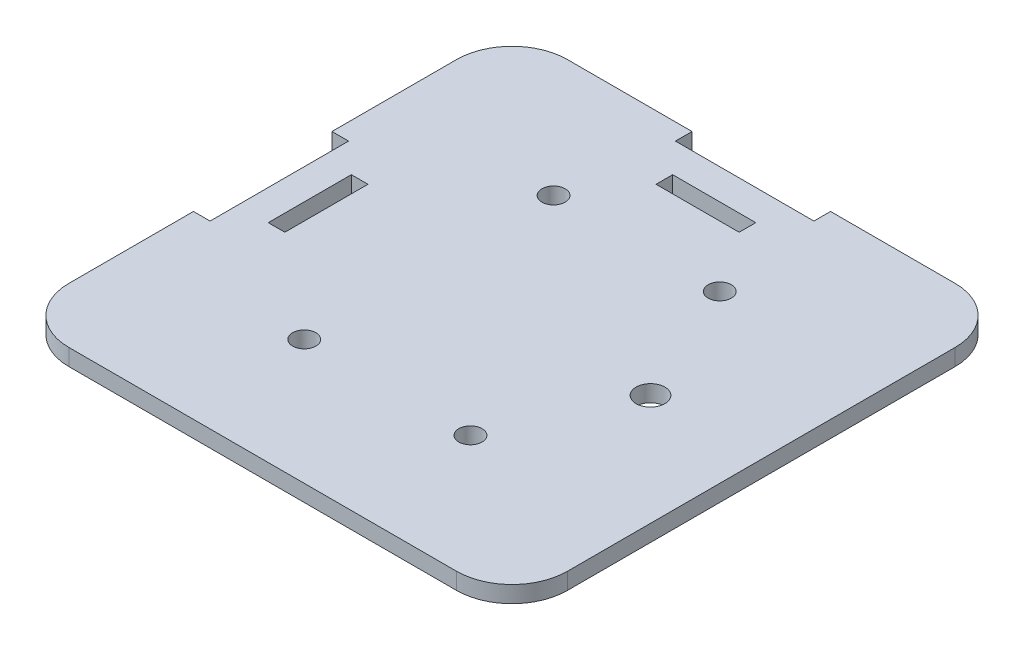
ISO-10303-21;
HEADER;
FILE_DESCRIPTION(('STEP AP214'),'2;1');
FILE_NAME('part.step','',(''),(''),'','','');
FILE_SCHEMA(('AUTOMOTIVE_DESIGN { 1 0 10303 214 1 1 1 1 }'));
ENDSEC;
DATA;
#1=APPLICATION_CONTEXT('core data for automotive mechanical design processes');
#2=APPLICATION_PROTOCOL_DEFINITION('international standard','automotive_design',2000,#1);
#3=PRODUCT_CONTEXT('',#1,'mechanical');
#4=PRODUCT('Part','Part','',(#3));
#5=PRODUCT_RELATED_PRODUCT_CATEGORY('part','',(#4));
#6=PRODUCT_DEFINITION_FORMATION('','',#4);
#7=PRODUCT_DEFINITION_CONTEXT('part definition',#1,'design');
#8=PRODUCT_DEFINITION('design','',#6,#7);
#9=PRODUCT_DEFINITION_SHAPE('','',#8);
#10=(LENGTH_UNIT() NAMED_UNIT(*) SI_UNIT(.MILLI.,.METRE.));
#11=(NAMED_UNIT(*) PLANE_ANGLE_UNIT() SI_UNIT($,.RADIAN.));
#12=(NAMED_UNIT(*) SI_UNIT($,.STERADIAN.) SOLID_ANGLE_UNIT());
#13=UNCERTAINTY_MEASURE_WITH_UNIT(LENGTH_MEASURE(1.E-05),#10,'distance_accuracy_value','');
#14=(GEOMETRIC_REPRESENTATION_CONTEXT(3) GLOBAL_UNCERTAINTY_ASSIGNED_CONTEXT((#13)) GLOBAL_UNIT_ASSIGNED_CONTEXT((#10,
#11,#12)) REPRESENTATION_CONTEXT('',''));
#15=CARTESIAN_POINT('',(0.,0.,0.));
#16=DIRECTION('',(0.,0.,1.));
#17=DIRECTION('',(1.,0.,0.));
#18=AXIS2_PLACEMENT_3D('',#15,#16,#17);
#19=CARTESIAN_POINT('',(-35.,3.,-35.));
#20=DIRECTION('',(0.,-1.,0.));
#21=DIRECTION('',(0.,0.,-1.));
#22=AXIS2_PLACEMENT_3D('',#19,#20,#21);
#23=CYLINDRICAL_SURFACE('',#22,10.);
#24=CARTESIAN_POINT('',(-35.,0.,-35.));
#25=DIRECTION('',(0.,1.,0.));
#26=DIRECTION('',(0.,0.,1.));
#27=AXIS2_PLACEMENT_3D('',#24,#25,#26);
#28=CIRCLE('',#27,10.);
#29=CARTESIAN_POINT('',(-45.,0.,-35.));
#30=VERTEX_POINT('',#29);
#31=CARTESIAN_POINT('',(-35.,0.,-45.));
#32=VERTEX_POINT('',#31);
#33=EDGE_CURVE('E269',#30,#32,#28,.F.);
#34=ORIENTED_EDGE('',*,*,#33,.F.);
#35=DIRECTION('',(0.,-1.,0.));
#36=VECTOR('',#35,1.);
#37=CARTESIAN_POINT('',(-45.,3.,-35.));
#38=LINE('',#37,#36);
#39=CARTESIAN_POINT('',(-45.,3.,-35.));
#40=VERTEX_POINT('',#39);
#41=EDGE_CURVE('E381',#40,#30,#38,.T.);
#42=ORIENTED_EDGE('',*,*,#41,.F.);
#43=CARTESIAN_POINT('',(-35.,3.,-35.));
#44=DIRECTION('',(0.,1.,0.));
#45=DIRECTION('',(0.,0.,1.));
#46=AXIS2_PLACEMENT_3D('',#43,#44,#45);
#47=CIRCLE('',#46,10.);
#48=CARTESIAN_POINT('',(-35.,3.,-45.));
#49=VERTEX_POINT('',#48);
#50=EDGE_CURVE('E272',#40,#49,#47,.F.);
#51=ORIENTED_EDGE('',*,*,#50,.T.);
#52=DIRECTION('',(0.,-1.,0.));
#53=VECTOR('',#52,1.);
#54=CARTESIAN_POINT('',(-35.,3.,-45.));
#55=LINE('',#54,#53);
#56=EDGE_CURVE('E346',#49,#32,#55,.T.);
#57=ORIENTED_EDGE('',*,*,#56,.T.);
#58=EDGE_LOOP('',(#34,#42,#51,#57));
#59=FACE_BOUND('',#58,.T.);
#60=ADVANCED_FACE('F35',(#59),#23,.T.);
#61=CARTESIAN_POINT('',(-45.,3.,0.));
#62=DIRECTION('',(-1.,0.,0.));
#63=DIRECTION('',(0.,0.,1.));
#64=AXIS2_PLACEMENT_3D('',#61,#62,#63);
#65=PLANE('',#64);
#66=DIRECTION('',(0.,0.,-1.));
#67=VECTOR('',#66,1.);
#68=CARTESIAN_POINT('',(-45.,0.,0.));
#69=LINE('',#68,#67);
#70=CARTESIAN_POINT('',(-45.,0.,-12.5));
#71=VERTEX_POINT('',#70);
#72=EDGE_CURVE('E311',#71,#30,#69,.T.);
#73=ORIENTED_EDGE('',*,*,#72,.F.);
#74=DIRECTION('',(0.,-1.,0.));
#75=VECTOR('',#74,1.);
#76=CARTESIAN_POINT('',(-45.,3.,-12.5));
#77=LINE('',#76,#75);
#78=CARTESIAN_POINT('',(-45.,3.,-12.5));
#79=VERTEX_POINT('',#78);
#80=EDGE_CURVE('E379',#79,#71,#77,.T.);
#81=ORIENTED_EDGE('',*,*,#80,.F.);
#82=DIRECTION('',(0.,0.,-1.));
#83=VECTOR('',#82,1.);
#84=CARTESIAN_POINT('',(-45.,3.,0.));
#85=LINE('',#84,#83);
#86=EDGE_CURVE('E275',#79,#40,#85,.T.);
#87=ORIENTED_EDGE('',*,*,#86,.T.);
#88=ORIENTED_EDGE('',*,*,#41,.T.);
#89=EDGE_LOOP('',(#73,#81,#87,#88));
#90=FACE_BOUND('',#89,.T.);
#91=ADVANCED_FACE('F420',(#90),#65,.T.);
#92=CARTESIAN_POINT('',(0.,3.,-12.5));
#93=DIRECTION('',(0.,0.,-1.));
#94=DIRECTION('',(-1.,0.,0.));
#95=AXIS2_PLACEMENT_3D('',#92,#93,#94);
#96=PLANE('',#95);
#97=DIRECTION('',(1.,0.,0.));
#98=VECTOR('',#97,1.);
#99=CARTESIAN_POINT('',(0.,0.,-12.5));
#100=LINE('',#99,#98);
#101=CARTESIAN_POINT('',(-42.,0.,-12.5));
#102=VERTEX_POINT('',#101);
#103=EDGE_CURVE('E314',#71,#102,#100,.T.);
#104=ORIENTED_EDGE('',*,*,#103,.T.);
#105=DIRECTION('',(0.,-1.,0.));
#106=VECTOR('',#105,1.);
#107=CARTESIAN_POINT('',(-42.,3.,-12.5));
#108=LINE('',#107,#106);
#109=CARTESIAN_POINT('',(-42.,3.,-12.5));
#110=VERTEX_POINT('',#109);
#111=EDGE_CURVE('E376',#110,#102,#108,.T.);
#112=ORIENTED_EDGE('',*,*,#111,.F.);
#113=DIRECTION('',(1.,0.,0.));
#114=VECTOR('',#113,1.);
#115=CARTESIAN_POINT('',(0.,3.,-12.5));
#116=LINE('',#115,#114);
#117=EDGE_CURVE('E279',#79,#110,#116,.T.);
#118=ORIENTED_EDGE('',*,*,#117,.F.);
#119=ORIENTED_EDGE('',*,*,#80,.T.);
#120=EDGE_LOOP('',(#104,#112,#118,#119));
#121=FACE_BOUND('',#120,.T.);
#122=ADVANCED_FACE('F425',(#121),#96,.F.);
#123=CARTESIAN_POINT('',(-42.,3.,0.));
#124=DIRECTION('',(1.,0.,0.));
#125=DIRECTION('',(0.,0.,-1.));
#126=AXIS2_PLACEMENT_3D('',#123,#124,#125);
#127=PLANE('',#126);
#128=DIRECTION('',(0.,0.,1.));
#129=VECTOR('',#128,1.);
#130=CARTESIAN_POINT('',(-42.,0.,0.));
#131=LINE('',#130,#129);
#132=CARTESIAN_POINT('',(-42.,0.,12.5));
#133=VERTEX_POINT('',#132);
#134=EDGE_CURVE('E317',#102,#133,#131,.T.);
#135=ORIENTED_EDGE('',*,*,#134,.T.);
#136=DIRECTION('',(0.,-1.,0.));
#137=VECTOR('',#136,1.);
#138=CARTESIAN_POINT('',(-42.,3.,12.5));
#139=LINE('',#138,#137);
#140=CARTESIAN_POINT('',(-42.,3.,12.5));
#141=VERTEX_POINT('',#140);
#142=EDGE_CURVE('E374',#141,#133,#139,.T.);
#143=ORIENTED_EDGE('',*,*,#142,.F.);
#144=DIRECTION('',(0.,0.,1.));
#145=VECTOR('',#144,1.);
#146=CARTESIAN_POINT('',(-42.,3.,0.));
#147=LINE('',#146,#145);
#148=EDGE_CURVE('E282',#110,#141,#147,.T.);
#149=ORIENTED_EDGE('',*,*,#148,.F.);
#150=ORIENTED_EDGE('',*,*,#111,.T.);
#151=EDGE_LOOP('',(#135,#143,#149,#150));
#152=FACE_BOUND('',#151,.T.);
#153=ADVANCED_FACE('F497',(#152),#127,.F.);
#154=CARTESIAN_POINT('',(0.,3.,12.5));
#155=DIRECTION('',(0.,0.,-1.));
#156=DIRECTION('',(-1.,0.,0.));
#157=AXIS2_PLACEMENT_3D('',#154,#155,#156);
#158=PLANE('',#157);
#159=DIRECTION('',(1.,0.,0.));
#160=VECTOR('',#159,1.);
#161=CARTESIAN_POINT('',(0.,0.,12.5));
#162=LINE('',#161,#160);
#163=CARTESIAN_POINT('',(-45.,0.,12.5));
#164=VERTEX_POINT('',#163);
#165=EDGE_CURVE('E320',#164,#133,#162,.T.);
#166=ORIENTED_EDGE('',*,*,#165,.F.);
#167=DIRECTION('',(0.,-1.,0.));
#168=VECTOR('',#167,1.);
#169=CARTESIAN_POINT('',(-45.,3.,12.5));
#170=LINE('',#169,#168);
#171=CARTESIAN_POINT('',(-45.,3.,12.5));
#172=VERTEX_POINT('',#171);
#173=EDGE_CURVE('E372',#172,#164,#170,.T.);
#174=ORIENTED_EDGE('',*,*,#173,.F.);
#175=DIRECTION('',(1.,0.,0.));
#176=VECTOR('',#175,1.);
#177=CARTESIAN_POINT('',(0.,3.,12.5));
#178=LINE('',#177,#176);
#179=EDGE_CURVE('E284',#172,#141,#178,.T.);
#180=ORIENTED_EDGE('',*,*,#179,.T.);
#181=ORIENTED_EDGE('',*,*,#142,.T.);
#182=EDGE_LOOP('',(#166,#174,#180,#181));
#183=FACE_BOUND('',#182,.T.);
#184=ADVANCED_FACE('F494',(#183),#158,.T.);
#185=CARTESIAN_POINT('',(-45.,0.,35.));
#186=VERTEX_POINT('',#185);
#187=EDGE_CURVE('E315',#186,#164,#69,.T.);
#188=ORIENTED_EDGE('',*,*,#187,.F.);
#189=DIRECTION('',(0.,-1.,0.));
#190=VECTOR('',#189,1.);
#191=CARTESIAN_POINT('',(-45.,3.,35.));
#192=LINE('',#191,#190);
#193=CARTESIAN_POINT('',(-45.,3.,35.));
#194=VERTEX_POINT('',#193);
#195=EDGE_CURVE('E370',#194,#186,#192,.T.);
#196=ORIENTED_EDGE('',*,*,#195,.F.);
#197=EDGE_CURVE('E280',#194,#172,#85,.T.);
#198=ORIENTED_EDGE('',*,*,#197,.T.);
#199=ORIENTED_EDGE('',*,*,#173,.T.);
#200=EDGE_LOOP('',(#188,#196,#198,#199));
#201=FACE_BOUND('',#200,.T.);
#202=ADVANCED_FACE('F428',(#201),#65,.T.);
#203=CARTESIAN_POINT('',(-35.,3.,35.));
#204=DIRECTION('',(0.,-1.,0.));
#205=DIRECTION('',(0.,0.,-1.));
#206=AXIS2_PLACEMENT_3D('',#203,#204,#205);
#207=CYLINDRICAL_SURFACE('',#206,10.);
#208=CARTESIAN_POINT('',(-35.,0.,35.));
#209=DIRECTION('',(0.,1.,0.));
#210=DIRECTION('',(0.,0.,1.));
#211=AXIS2_PLACEMENT_3D('',#208,#209,#210);
#212=CIRCLE('',#211,10.);
#213=CARTESIAN_POINT('',(-35.,0.,45.));
#214=VERTEX_POINT('',#213);
#215=EDGE_CURVE('E323',#186,#214,#212,.T.);
#216=ORIENTED_EDGE('',*,*,#215,.T.);
#217=DIRECTION('',(0.,-1.,0.));
#218=VECTOR('',#217,1.);
#219=CARTESIAN_POINT('',(-35.,3.,45.));
#220=LINE('',#219,#218);
#221=CARTESIAN_POINT('',(-35.,3.,45.));
#222=VERTEX_POINT('',#221);
#223=EDGE_CURVE('E368',#222,#214,#220,.T.);
#224=ORIENTED_EDGE('',*,*,#223,.F.);
#225=CARTESIAN_POINT('',(-35.,3.,35.));
#226=DIRECTION('',(0.,1.,0.));
#227=DIRECTION('',(0.,0.,1.));
#228=AXIS2_PLACEMENT_3D('',#225,#226,#227);
#229=CIRCLE('',#228,10.);
#230=EDGE_CURVE('E287',#194,#222,#229,.T.);
#231=ORIENTED_EDGE('',*,*,#230,.F.);
#232=ORIENTED_EDGE('',*,*,#195,.T.);
#233=EDGE_LOOP('',(#216,#224,#231,#232));
#234=FACE_BOUND('',#233,.T.);
#235=ADVANCED_FACE('F509',(#234),#207,.T.);
#236=CARTESIAN_POINT('',(0.,3.,45.));
#237=DIRECTION('',(0.,0.,1.));
#238=DIRECTION('',(1.,0.,0.));
#239=AXIS2_PLACEMENT_3D('',#236,#237,#238);
#240=PLANE('',#239);
#241=DIRECTION('',(-1.,0.,0.));
#242=VECTOR('',#241,1.);
#243=CARTESIAN_POINT('',(0.,0.,45.));
#244=LINE('',#243,#242);
#245=CARTESIAN_POINT('',(35.,0.,45.));
#246=VERTEX_POINT('',#245);
#247=EDGE_CURVE('E326',#246,#214,#244,.T.);
#248=ORIENTED_EDGE('',*,*,#247,.F.);
#249=DIRECTION('',(0.,-1.,0.));
#250=VECTOR('',#249,1.);
#251=CARTESIAN_POINT('',(35.,3.,45.));
#252=LINE('',#251,#250);
#253=CARTESIAN_POINT('',(35.,3.,45.));
#254=VERTEX_POINT('',#253);
#255=EDGE_CURVE('E366',#254,#246,#252,.T.);
#256=ORIENTED_EDGE('',*,*,#255,.F.);
#257=DIRECTION('',(-1.,0.,0.));
#258=VECTOR('',#257,1.);
#259=CARTESIAN_POINT('',(0.,3.,45.));
#260=LINE('',#259,#258);
#261=EDGE_CURVE('E289',#254,#222,#260,.T.);
#262=ORIENTED_EDGE('',*,*,#261,.T.);
#263=ORIENTED_EDGE('',*,*,#223,.T.);
#264=EDGE_LOOP('',(#248,#256,#262,#263));
#265=FACE_BOUND('',#264,.T.);
#266=ADVANCED_FACE('F481',(#265),#240,.T.);
#267=CARTESIAN_POINT('',(35.,3.,35.));
#268=DIRECTION('',(0.,-1.,0.));
#269=DIRECTION('',(0.,0.,-1.));
#270=AXIS2_PLACEMENT_3D('',#267,#268,#269);
#271=CYLINDRICAL_SURFACE('',#270,10.);
#272=CARTESIAN_POINT('',(35.,0.,35.));
#273=DIRECTION('',(0.,1.,0.));
#274=DIRECTION('',(0.,0.,1.));
#275=AXIS2_PLACEMENT_3D('',#272,#273,#274);
#276=CIRCLE('',#275,10.);
#277=CARTESIAN_POINT('',(45.,0.,35.));
#278=VERTEX_POINT('',#277);
#279=EDGE_CURVE('E329',#246,#278,#276,.T.);
#280=ORIENTED_EDGE('',*,*,#279,.T.);
#281=DIRECTION('',(0.,-1.,0.));
#282=VECTOR('',#281,1.);
#283=CARTESIAN_POINT('',(45.,3.,35.));
#284=LINE('',#283,#282);
#285=CARTESIAN_POINT('',(45.,3.,35.));
#286=VERTEX_POINT('',#285);
#287=EDGE_CURVE('E363',#286,#278,#284,.T.);
#288=ORIENTED_EDGE('',*,*,#287,.F.);
#289=CARTESIAN_POINT('',(35.,3.,35.));
#290=DIRECTION('',(0.,1.,0.));
#291=DIRECTION('',(0.,0.,1.));
#292=AXIS2_PLACEMENT_3D('',#289,#290,#291);
#293=CIRCLE('',#292,10.);
#294=EDGE_CURVE('E292',#254,#286,#293,.T.);
#295=ORIENTED_EDGE('',*,*,#294,.F.);
#296=ORIENTED_EDGE('',*,*,#255,.T.);
#297=EDGE_LOOP('',(#280,#288,#295,#296));
#298=FACE_BOUND('',#297,.T.);
#299=ADVANCED_FACE('F478',(#298),#271,.T.);
#300=CARTESIAN_POINT('',(45.,3.,0.));
#301=DIRECTION('',(-1.,0.,0.));
#302=DIRECTION('',(0.,0.,1.));
#303=AXIS2_PLACEMENT_3D('',#300,#301,#302);
#304=PLANE('',#303);
#305=DIRECTION('',(0.,0.,-1.));
#306=VECTOR('',#305,1.);
#307=CARTESIAN_POINT('',(45.,0.,0.));
#308=LINE('',#307,#306);
#309=CARTESIAN_POINT('',(45.,0.,-35.));
#310=VERTEX_POINT('',#309);
#311=EDGE_CURVE('E331',#278,#310,#308,.T.);
#312=ORIENTED_EDGE('',*,*,#311,.T.);
#313=DIRECTION('',(0.,-1.,0.));
#314=VECTOR('',#313,1.);
#315=CARTESIAN_POINT('',(45.,3.,-35.));
#316=LINE('',#315,#314);
#317=CARTESIAN_POINT('',(45.,3.,-35.));
#318=VERTEX_POINT('',#317);
#319=EDGE_CURVE('E360',#318,#310,#316,.T.);
#320=ORIENTED_EDGE('',*,*,#319,.F.);
#321=DIRECTION('',(0.,0.,-1.));
#322=VECTOR('',#321,1.);
#323=CARTESIAN_POINT('',(45.,3.,0.));
#324=LINE('',#323,#322);
#325=EDGE_CURVE('E294',#286,#318,#324,.T.);
#326=ORIENTED_EDGE('',*,*,#325,.F.);
#327=ORIENTED_EDGE('',*,*,#287,.T.);
#328=EDGE_LOOP('',(#312,#320,#326,#327));
#329=FACE_BOUND('',#328,.T.);
#330=ADVANCED_FACE('F473',(#329),#304,.F.);
#331=CARTESIAN_POINT('',(35.,3.,-35.));
#332=DIRECTION('',(0.,-1.,0.));
#333=DIRECTION('',(0.,0.,-1.));
#334=AXIS2_PLACEMENT_3D('',#331,#332,#333);
#335=CYLINDRICAL_SURFACE('',#334,10.);
#336=CARTESIAN_POINT('',(35.,0.,-35.));
#337=DIRECTION('',(0.,1.,0.));
#338=DIRECTION('',(0.,0.,1.));
#339=AXIS2_PLACEMENT_3D('',#336,#337,#338);
#340=CIRCLE('',#339,10.);
#341=CARTESIAN_POINT('',(35.,0.,-45.));
#342=VERTEX_POINT('',#341);
#343=EDGE_CURVE('E333',#310,#342,#340,.T.);
#344=ORIENTED_EDGE('',*,*,#343,.T.);
#345=DIRECTION('',(0.,-1.,0.));
#346=VECTOR('',#345,1.);
#347=CARTESIAN_POINT('',(35.,3.,-45.));
#348=LINE('',#347,#346);
#349=CARTESIAN_POINT('',(35.,3.,-45.));
#350=VERTEX_POINT('',#349);
#351=EDGE_CURVE('E357',#350,#342,#348,.T.);
#352=ORIENTED_EDGE('',*,*,#351,.F.);
#353=CARTESIAN_POINT('',(35.,3.,-35.));
#354=DIRECTION('',(0.,1.,0.));
#355=DIRECTION('',(0.,0.,1.));
#356=AXIS2_PLACEMENT_3D('',#353,#354,#355);
#357=CIRCLE('',#356,10.);
#358=EDGE_CURVE('E296',#318,#350,#357,.T.);
#359=ORIENTED_EDGE('',*,*,#358,.F.);
#360=ORIENTED_EDGE('',*,*,#319,.T.);
#361=EDGE_LOOP('',(#344,#352,#359,#360));
#362=FACE_BOUND('',#361,.T.);
#363=ADVANCED_FACE('F467',(#362),#335,.T.);
#364=CARTESIAN_POINT('',(0.,3.,-45.));
#365=DIRECTION('',(0.,0.,1.));
#366=DIRECTION('',(1.,0.,0.));
#367=AXIS2_PLACEMENT_3D('',#364,#365,#366);
#368=PLANE('',#367);
#369=DIRECTION('',(-1.,0.,0.));
#370=VECTOR('',#369,1.);
#371=CARTESIAN_POINT('',(0.,0.,-45.));
#372=LINE('',#371,#370);
#373=CARTESIAN_POINT('',(12.5,0.,-45.));
#374=VERTEX_POINT('',#373);
#375=EDGE_CURVE('E335',#342,#374,#372,.T.);
#376=ORIENTED_EDGE('',*,*,#375,.T.);
#377=DIRECTION('',(0.,-1.,0.));
#378=VECTOR('',#377,1.);
#379=CARTESIAN_POINT('',(12.5,3.,-45.));
#380=LINE('',#379,#378);
#381=CARTESIAN_POINT('',(12.5,3.,-45.));
#382=VERTEX_POINT('',#381);
#383=EDGE_CURVE('E354',#382,#374,#380,.T.);
#384=ORIENTED_EDGE('',*,*,#383,.F.);
#385=DIRECTION('',(-1.,0.,0.));
#386=VECTOR('',#385,1.);
#387=CARTESIAN_POINT('',(0.,3.,-45.));
#388=LINE('',#387,#386);
#389=EDGE_CURVE('E298',#350,#382,#388,.T.);
#390=ORIENTED_EDGE('',*,*,#389,.F.);
#391=ORIENTED_EDGE('',*,*,#351,.T.);
#392=EDGE_LOOP('',(#376,#384,#390,#391));
#393=FACE_BOUND('',#392,.T.);
#394=ADVANCED_FACE('F463',(#393),#368,.F.);
#395=CARTESIAN_POINT('',(12.5,3.,0.));
#396=DIRECTION('',(1.,0.,0.));
#397=DIRECTION('',(0.,0.,-1.));
#398=AXIS2_PLACEMENT_3D('',#395,#396,#397);
#399=PLANE('',#398);
#400=DIRECTION('',(0.,0.,1.));
#401=VECTOR('',#400,1.);
#402=CARTESIAN_POINT('',(12.5,0.,0.));
#403=LINE('',#402,#401);
#404=CARTESIAN_POINT('',(12.5,0.,-42.));
#405=VERTEX_POINT('',#404);
#406=EDGE_CURVE('E337',#374,#405,#403,.T.);
#407=ORIENTED_EDGE('',*,*,#406,.T.);
#408=DIRECTION('',(0.,-1.,0.));
#409=VECTOR('',#408,1.);
#410=CARTESIAN_POINT('',(12.5,3.,-42.));
#411=LINE('',#410,#409);
#412=CARTESIAN_POINT('',(12.5,3.,-42.));
#413=VERTEX_POINT('',#412);
#414=EDGE_CURVE('E352',#413,#405,#411,.T.);
#415=ORIENTED_EDGE('',*,*,#414,.F.);
#416=DIRECTION('',(0.,0.,1.));
#417=VECTOR('',#416,1.);
#418=CARTESIAN_POINT('',(12.5,3.,0.));
#419=LINE('',#418,#417);
#420=EDGE_CURVE('E300',#382,#413,#419,.T.);
#421=ORIENTED_EDGE('',*,*,#420,.F.);
#422=ORIENTED_EDGE('',*,*,#383,.T.);
#423=EDGE_LOOP('',(#407,#415,#421,#422));
#424=FACE_BOUND('',#423,.T.);
#425=ADVANCED_FACE('F458',(#424),#399,.F.);
#426=CARTESIAN_POINT('',(0.,3.,-42.));
#427=DIRECTION('',(0.,0.,-1.));
#428=DIRECTION('',(-1.,0.,0.));
#429=AXIS2_PLACEMENT_3D('',#426,#427,#428);
#430=PLANE('',#429);
#431=DIRECTION('',(1.,0.,0.));
#432=VECTOR('',#431,1.);
#433=CARTESIAN_POINT('',(0.,0.,-42.));
#434=LINE('',#433,#432);
#435=CARTESIAN_POINT('',(-12.5,0.,-42.));
#436=VERTEX_POINT('',#435);
#437=EDGE_CURVE('E340',#436,#405,#434,.T.);
#438=ORIENTED_EDGE('',*,*,#437,.F.);
#439=DIRECTION('',(0.,-1.,0.));
#440=VECTOR('',#439,1.);
#441=CARTESIAN_POINT('',(-12.5,3.,-42.));
#442=LINE('',#441,#440);
#443=CARTESIAN_POINT('',(-12.5,3.,-42.));
#444=VERTEX_POINT('',#443);
#445=EDGE_CURVE('E350',#444,#436,#442,.T.);
#446=ORIENTED_EDGE('',*,*,#445,.F.);
#447=DIRECTION('',(1.,0.,0.));
#448=VECTOR('',#447,1.);
#449=CARTESIAN_POINT('',(0.,3.,-42.));
#450=LINE('',#449,#448);
#451=EDGE_CURVE('E303',#444,#413,#450,.T.);
#452=ORIENTED_EDGE('',*,*,#451,.T.);
#453=ORIENTED_EDGE('',*,*,#414,.T.);
#454=EDGE_LOOP('',(#438,#446,#452,#453));
#455=FACE_BOUND('',#454,.T.);
#456=ADVANCED_FACE('F452',(#455),#430,.T.);
#457=CARTESIAN_POINT('',(-12.5,3.,0.));
#458=DIRECTION('',(1.,0.,0.));
#459=DIRECTION('',(0.,0.,-1.));
#460=AXIS2_PLACEMENT_3D('',#457,#458,#459);
#461=PLANE('',#460);
#462=DIRECTION('',(0.,0.,1.));
#463=VECTOR('',#462,1.);
#464=CARTESIAN_POINT('',(-12.5,0.,0.));
#465=LINE('',#464,#463);
#466=CARTESIAN_POINT('',(-12.5,0.,-45.));
#467=VERTEX_POINT('',#466);
#468=EDGE_CURVE('E343',#467,#436,#465,.T.);
#469=ORIENTED_EDGE('',*,*,#468,.F.);
#470=DIRECTION('',(0.,-1.,0.));
#471=VECTOR('',#470,1.);
#472=CARTESIAN_POINT('',(-12.5,3.,-45.));
#473=LINE('',#472,#471);
#474=CARTESIAN_POINT('',(-12.5,3.,-45.));
#475=VERTEX_POINT('',#474);
#476=EDGE_CURVE('E348',#475,#467,#473,.T.);
#477=ORIENTED_EDGE('',*,*,#476,.F.);
#478=DIRECTION('',(0.,0.,1.));
#479=VECTOR('',#478,1.);
#480=CARTESIAN_POINT('',(-12.5,3.,0.));
#481=LINE('',#480,#479);
#482=EDGE_CURVE('E306',#475,#444,#481,.T.);
#483=ORIENTED_EDGE('',*,*,#482,.T.);
#484=ORIENTED_EDGE('',*,*,#445,.T.);
#485=EDGE_LOOP('',(#469,#477,#483,#484));
#486=FACE_BOUND('',#485,.T.);
#487=ADVANCED_FACE('F449',(#486),#461,.T.);
#488=EDGE_CURVE('E276',#467,#32,#372,.T.);
#489=ORIENTED_EDGE('',*,*,#488,.T.);
#490=ORIENTED_EDGE('',*,*,#56,.F.);
#491=EDGE_CURVE('E301',#475,#49,#388,.T.);
#492=ORIENTED_EDGE('',*,*,#491,.F.);
#493=ORIENTED_EDGE('',*,*,#476,.T.);
#494=EDGE_LOOP('',(#489,#490,#492,#493));
#495=FACE_BOUND('',#494,.T.);
#496=ADVANCED_FACE('F446',(#495),#368,.F.);
#497=CARTESIAN_POINT('',(0.,3.,0.));
#498=DIRECTION('',(0.,1.,0.));
#499=DIRECTION('',(0.,0.,1.));
#500=AXIS2_PLACEMENT_3D('',#497,#498,#499);
#501=PLANE('',#500);
#502=CARTESIAN_POINT('',(25.,3.,-1.01467489374629E-13));
#503=DIRECTION('',(0.,1.,0.));
#504=DIRECTION('',(0.,0.,1.));
#505=AXIS2_PLACEMENT_3D('',#502,#503,#504);
#506=CIRCLE('',#505,2.6);
#507=CARTESIAN_POINT('',(25.,3.,2.5999999999999));
#508=VERTEX_POINT('',#507);
#509=EDGE_CURVE('E652',#508,#508,#506,.T.);
#510=ORIENTED_EDGE('',*,*,#509,.F.);
#511=EDGE_LOOP('',(#510));
#512=FACE_BOUND('',#511,.T.);
#513=DIRECTION('',(0.,0.,1.));
#514=VECTOR('',#513,1.);
#515=CARTESIAN_POINT('',(-7.49999999999999,3.,-33.5));
#516=LINE('',#515,#514);
#517=CARTESIAN_POINT('',(-7.49999999999999,3.,-36.5));
#518=VERTEX_POINT('',#517);
#519=CARTESIAN_POINT('',(-7.49999999999999,3.,-33.5));
#520=VERTEX_POINT('',#519);
#521=EDGE_CURVE('E50',#518,#520,#516,.T.);
#522=ORIENTED_EDGE('',*,*,#521,.F.);
#523=DIRECTION('',(-1.,0.,0.));
#524=VECTOR('',#523,1.);
#525=CARTESIAN_POINT('',(7.50000000000001,3.,-36.5));
#526=LINE('',#525,#524);
#527=CARTESIAN_POINT('',(7.50000000000001,3.,-36.5));
#528=VERTEX_POINT('',#527);
#529=EDGE_CURVE('E220',#528,#518,#526,.T.);
#530=ORIENTED_EDGE('',*,*,#529,.F.);
#531=DIRECTION('',(0.,0.,-1.));
#532=VECTOR('',#531,1.);
#533=CARTESIAN_POINT('',(7.50000000000001,3.,-33.5));
#534=LINE('',#533,#532);
#535=CARTESIAN_POINT('',(7.50000000000001,3.,-33.5));
#536=VERTEX_POINT('',#535);
#537=EDGE_CURVE('E203',#536,#528,#534,.T.);
#538=ORIENTED_EDGE('',*,*,#537,.F.);
#539=DIRECTION('',(1.,0.,0.));
#540=VECTOR('',#539,1.);
#541=CARTESIAN_POINT('',(7.50000000000001,3.,-33.5));
#542=LINE('',#541,#540);
#543=EDGE_CURVE('E213',#520,#536,#542,.T.);
#544=ORIENTED_EDGE('',*,*,#543,.F.);
#545=EDGE_LOOP('',(#522,#530,#538,#544));
#546=FACE_BOUND('',#545,.T.);
#547=DIRECTION('',(0.,0.,1.));
#548=VECTOR('',#547,1.);
#549=CARTESIAN_POINT('',(-36.5,3.,7.5));
#550=LINE('',#549,#548);
#551=CARTESIAN_POINT('',(-36.5,3.,-7.5));
#552=VERTEX_POINT('',#551);
#553=CARTESIAN_POINT('',(-36.5,3.,7.5));
#554=VERTEX_POINT('',#553);
#555=EDGE_CURVE('E58',#552,#554,#550,.T.);
#556=ORIENTED_EDGE('',*,*,#555,.F.);
#557=DIRECTION('',(-1.,0.,0.));
#558=VECTOR('',#557,1.);
#559=CARTESIAN_POINT('',(-33.5,3.,-7.5));
#560=LINE('',#559,#558);
#561=CARTESIAN_POINT('',(-33.5,3.,-7.5));
#562=VERTEX_POINT('',#561);
#563=EDGE_CURVE('E237',#562,#552,#560,.T.);
#564=ORIENTED_EDGE('',*,*,#563,.F.);
#565=DIRECTION('',(0.,0.,-1.));
#566=VECTOR('',#565,1.);
#567=CARTESIAN_POINT('',(-33.5,3.,7.5));
#568=LINE('',#567,#566);
#569=CARTESIAN_POINT('',(-33.5,3.,7.5));
#570=VERTEX_POINT('',#569);
#571=EDGE_CURVE('E234',#570,#562,#568,.T.);
#572=ORIENTED_EDGE('',*,*,#571,.F.);
#573=DIRECTION('',(1.,0.,0.));
#574=VECTOR('',#573,1.);
#575=CARTESIAN_POINT('',(-33.5,3.,7.5));
#576=LINE('',#575,#574);
#577=EDGE_CURVE('E231',#554,#570,#576,.T.);
#578=ORIENTED_EDGE('',*,*,#577,.F.);
#579=EDGE_LOOP('',(#556,#564,#572,#578));
#580=FACE_BOUND('',#579,.T.);
#581=CARTESIAN_POINT('',(-15.,3.,22.5));
#582=DIRECTION('',(0.,1.,0.));
#583=DIRECTION('',(0.,0.,-1.));
#584=AXIS2_PLACEMENT_3D('',#581,#582,#583);
#585=CIRCLE('',#584,2.1);
#586=CARTESIAN_POINT('',(-15.,3.,20.4));
#587=VERTEX_POINT('',#586);
#588=EDGE_CURVE('E227',#587,#587,#585,.T.);
#589=ORIENTED_EDGE('',*,*,#588,.F.);
#590=EDGE_LOOP('',(#589));
#591=FACE_BOUND('',#590,.T.);
#592=CARTESIAN_POINT('',(15.,3.,22.5));
#593=DIRECTION('',(0.,1.,0.));
#594=DIRECTION('',(0.,0.,1.));
#595=AXIS2_PLACEMENT_3D('',#592,#593,#594);
#596=CIRCLE('',#595,2.1);
#597=CARTESIAN_POINT('',(15.,3.,24.6));
#598=VERTEX_POINT('',#597);
#599=EDGE_CURVE('E258',#598,#598,#596,.T.);
#600=ORIENTED_EDGE('',*,*,#599,.F.);
#601=EDGE_LOOP('',(#600));
#602=FACE_BOUND('',#601,.T.);
#603=CARTESIAN_POINT('',(15.,3.,-22.5));
#604=DIRECTION('',(0.,1.,0.));
#605=DIRECTION('',(0.,0.,-1.));
#606=AXIS2_PLACEMENT_3D('',#603,#604,#605);
#607=CIRCLE('',#606,2.1);
#608=CARTESIAN_POINT('',(15.,3.,-24.6));
#609=VERTEX_POINT('',#608);
#610=EDGE_CURVE('E252',#609,#609,#607,.T.);
#611=ORIENTED_EDGE('',*,*,#610,.F.);
#612=EDGE_LOOP('',(#611));
#613=FACE_BOUND('',#612,.T.);
#614=CARTESIAN_POINT('',(-15.,3.,-22.5));
#615=DIRECTION('',(0.,1.,0.));
#616=DIRECTION('',(0.,0.,1.));
#617=AXIS2_PLACEMENT_3D('',#614,#615,#616);
#618=CIRCLE('',#617,2.1);
#619=CARTESIAN_POINT('',(-15.,3.,-20.4));
#620=VERTEX_POINT('',#619);
#621=EDGE_CURVE('E251',#620,#620,#618,.T.);
#622=ORIENTED_EDGE('',*,*,#621,.F.);
#623=EDGE_LOOP('',(#622));
#624=FACE_BOUND('',#623,.T.);
#625=ORIENTED_EDGE('',*,*,#50,.F.);
#626=ORIENTED_EDGE('',*,*,#86,.F.);
#627=ORIENTED_EDGE('',*,*,#117,.T.);
#628=ORIENTED_EDGE('',*,*,#148,.T.);
#629=ORIENTED_EDGE('',*,*,#179,.F.);
#630=ORIENTED_EDGE('',*,*,#197,.F.);
#631=ORIENTED_EDGE('',*,*,#230,.T.);
#632=ORIENTED_EDGE('',*,*,#261,.F.);
#633=ORIENTED_EDGE('',*,*,#294,.T.);
#634=ORIENTED_EDGE('',*,*,#325,.T.);
#635=ORIENTED_EDGE('',*,*,#358,.T.);
#636=ORIENTED_EDGE('',*,*,#389,.T.);
#637=ORIENTED_EDGE('',*,*,#420,.T.);
#638=ORIENTED_EDGE('',*,*,#451,.F.);
#639=ORIENTED_EDGE('',*,*,#482,.F.);
#640=ORIENTED_EDGE('',*,*,#491,.T.);
#641=EDGE_LOOP('',(#625,#626,#627,#628,#629,#630,#631,#632,#633,#634,#635,#636,#637,#638,#639,#640));
#642=FACE_BOUND('',#641,.T.);
#643=ADVANCED_FACE('F217',(#512,#546,#580,#591,#602,#613,#624,#642),#501,.T.);
#644=CARTESIAN_POINT('',(0.,0.,0.));
#645=DIRECTION('',(0.,1.,0.));
#646=DIRECTION('',(0.,0.,1.));
#647=AXIS2_PLACEMENT_3D('',#644,#645,#646);
#648=PLANE('',#647);
#649=CARTESIAN_POINT('',(25.,0.,-1.01467489374629E-13));
#650=DIRECTION('',(0.,1.,0.));
#651=DIRECTION('',(0.,0.,1.));
#652=AXIS2_PLACEMENT_3D('',#649,#650,#651);
#653=CIRCLE('',#652,2.6);
#654=CARTESIAN_POINT('',(25.,0.,2.5999999999999));
#655=VERTEX_POINT('',#654);
#656=EDGE_CURVE('E38',#655,#655,#653,.T.);
#657=ORIENTED_EDGE('',*,*,#656,.T.);
#658=EDGE_LOOP('',(#657));
#659=FACE_BOUND('',#658,.T.);
#660=DIRECTION('',(-1.,0.,0.));
#661=VECTOR('',#660,1.);
#662=CARTESIAN_POINT('',(0.,0.,-36.5));
#663=LINE('',#662,#661);
#664=CARTESIAN_POINT('',(7.50000000000001,0.,-36.5));
#665=VERTEX_POINT('',#664);
#666=CARTESIAN_POINT('',(-7.49999999999999,0.,-36.5));
#667=VERTEX_POINT('',#666);
#668=EDGE_CURVE('E43',#665,#667,#663,.T.);
#669=ORIENTED_EDGE('',*,*,#668,.T.);
#670=DIRECTION('',(0.,0.,1.));
#671=VECTOR('',#670,1.);
#672=CARTESIAN_POINT('',(-7.5,0.,0.));
#673=LINE('',#672,#671);
#674=CARTESIAN_POINT('',(-7.49999999999999,0.,-33.5));
#675=VERTEX_POINT('',#674);
#676=EDGE_CURVE('E11',#667,#675,#673,.T.);
#677=ORIENTED_EDGE('',*,*,#676,.T.);
#678=DIRECTION('',(1.,0.,0.));
#679=VECTOR('',#678,1.);
#680=CARTESIAN_POINT('',(0.,0.,-33.5));
#681=LINE('',#680,#679);
#682=CARTESIAN_POINT('',(7.50000000000001,0.,-33.5));
#683=VERTEX_POINT('',#682);
#684=EDGE_CURVE('E395',#675,#683,#681,.T.);
#685=ORIENTED_EDGE('',*,*,#684,.T.);
#686=DIRECTION('',(0.,0.,-1.));
#687=VECTOR('',#686,1.);
#688=CARTESIAN_POINT('',(7.50000000000001,0.,0.));
#689=LINE('',#688,#687);
#690=EDGE_CURVE('E206',#683,#665,#689,.T.);
#691=ORIENTED_EDGE('',*,*,#690,.T.);
#692=EDGE_LOOP('',(#669,#677,#685,#691));
#693=FACE_BOUND('',#692,.T.);
#694=DIRECTION('',(-1.,0.,0.));
#695=VECTOR('',#694,1.);
#696=CARTESIAN_POINT('',(0.,0.,-7.5));
#697=LINE('',#696,#695);
#698=CARTESIAN_POINT('',(-33.5,0.,-7.5));
#699=VERTEX_POINT('',#698);
#700=CARTESIAN_POINT('',(-36.5,0.,-7.5));
#701=VERTEX_POINT('',#700);
#702=EDGE_CURVE('E389',#699,#701,#697,.T.);
#703=ORIENTED_EDGE('',*,*,#702,.T.);
#704=DIRECTION('',(0.,0.,1.));
#705=VECTOR('',#704,1.);
#706=CARTESIAN_POINT('',(-36.5,0.,0.));
#707=LINE('',#706,#705);
#708=CARTESIAN_POINT('',(-36.5,0.,7.5));
#709=VERTEX_POINT('',#708);
#710=EDGE_CURVE('E392',#701,#709,#707,.T.);
#711=ORIENTED_EDGE('',*,*,#710,.T.);
#712=DIRECTION('',(1.,0.,0.));
#713=VECTOR('',#712,1.);
#714=CARTESIAN_POINT('',(0.,0.,7.5));
#715=LINE('',#714,#713);
#716=CARTESIAN_POINT('',(-33.5,0.,7.5));
#717=VERTEX_POINT('',#716);
#718=EDGE_CURVE('E383',#709,#717,#715,.T.);
#719=ORIENTED_EDGE('',*,*,#718,.T.);
#720=DIRECTION('',(0.,0.,-1.));
#721=VECTOR('',#720,1.);
#722=CARTESIAN_POINT('',(-33.5,0.,0.));
#723=LINE('',#722,#721);
#724=EDGE_CURVE('E386',#717,#699,#723,.T.);
#725=ORIENTED_EDGE('',*,*,#724,.T.);
#726=EDGE_LOOP('',(#703,#711,#719,#725));
#727=FACE_BOUND('',#726,.T.);
#728=CARTESIAN_POINT('',(-15.,0.,22.5));
#729=DIRECTION('',(0.,1.,0.));
#730=DIRECTION('',(0.,0.,-1.));
#731=AXIS2_PLACEMENT_3D('',#728,#729,#730);
#732=CIRCLE('',#731,2.1);
#733=CARTESIAN_POINT('',(-15.,0.,20.4));
#734=VERTEX_POINT('',#733);
#735=EDGE_CURVE('E261',#734,#734,#732,.T.);
#736=ORIENTED_EDGE('',*,*,#735,.T.);
#737=EDGE_LOOP('',(#736));
#738=FACE_BOUND('',#737,.T.);
#739=CARTESIAN_POINT('',(15.,0.,22.5));
#740=DIRECTION('',(0.,1.,0.));
#741=DIRECTION('',(0.,0.,1.));
#742=AXIS2_PLACEMENT_3D('',#739,#740,#741);
#743=CIRCLE('',#742,2.1);
#744=CARTESIAN_POINT('',(15.,0.,24.6));
#745=VERTEX_POINT('',#744);
#746=EDGE_CURVE('E255',#745,#745,#743,.T.);
#747=ORIENTED_EDGE('',*,*,#746,.T.);
#748=EDGE_LOOP('',(#747));
#749=FACE_BOUND('',#748,.T.);
#750=CARTESIAN_POINT('',(15.,0.,-22.5));
#751=DIRECTION('',(0.,1.,0.));
#752=DIRECTION('',(0.,0.,-1.));
#753=AXIS2_PLACEMENT_3D('',#750,#751,#752);
#754=CIRCLE('',#753,2.1);
#755=CARTESIAN_POINT('',(15.,0.,-24.6));
#756=VERTEX_POINT('',#755);
#757=EDGE_CURVE('E248',#756,#756,#754,.T.);
#758=ORIENTED_EDGE('',*,*,#757,.T.);
#759=EDGE_LOOP('',(#758));
#760=FACE_BOUND('',#759,.T.);
#761=CARTESIAN_POINT('',(-15.,0.,-22.5));
#762=DIRECTION('',(0.,1.,0.));
#763=DIRECTION('',(0.,0.,1.));
#764=AXIS2_PLACEMENT_3D('',#761,#762,#763);
#765=CIRCLE('',#764,2.1);
#766=CARTESIAN_POINT('',(-15.,0.,-20.4));
#767=VERTEX_POINT('',#766);
#768=EDGE_CURVE('E266',#767,#767,#765,.T.);
#769=ORIENTED_EDGE('',*,*,#768,.T.);
#770=EDGE_LOOP('',(#769));
#771=FACE_BOUND('',#770,.T.);
#772=ORIENTED_EDGE('',*,*,#33,.T.);
#773=ORIENTED_EDGE('',*,*,#488,.F.);
#774=ORIENTED_EDGE('',*,*,#468,.T.);
#775=ORIENTED_EDGE('',*,*,#437,.T.);
#776=ORIENTED_EDGE('',*,*,#406,.F.);
#777=ORIENTED_EDGE('',*,*,#375,.F.);
#778=ORIENTED_EDGE('',*,*,#343,.F.);
#779=ORIENTED_EDGE('',*,*,#311,.F.);
#780=ORIENTED_EDGE('',*,*,#279,.F.);
#781=ORIENTED_EDGE('',*,*,#247,.T.);
#782=ORIENTED_EDGE('',*,*,#215,.F.);
#783=ORIENTED_EDGE('',*,*,#187,.T.);
#784=ORIENTED_EDGE('',*,*,#165,.T.);
#785=ORIENTED_EDGE('',*,*,#134,.F.);
#786=ORIENTED_EDGE('',*,*,#103,.F.);
#787=ORIENTED_EDGE('',*,*,#72,.T.);
#788=EDGE_LOOP('',(#772,#773,#774,#775,#776,#777,#778,#779,#780,#781,#782,#783,#784,#785,#786,#787));
#789=FACE_BOUND('',#788,.T.);
#790=ADVANCED_FACE('F400',(#659,#693,#727,#738,#749,#760,#771,#789),#648,.F.);
#791=CARTESIAN_POINT('',(-15.,0.,-22.5));
#792=DIRECTION('',(0.,1.,0.));
#793=DIRECTION('',(0.,0.,1.));
#794=AXIS2_PLACEMENT_3D('',#791,#792,#793);
#795=CYLINDRICAL_SURFACE('',#794,2.1);
#796=ORIENTED_EDGE('',*,*,#768,.F.);
#797=EDGE_LOOP('',(#796));
#798=FACE_BOUND('',#797,.T.);
#799=ORIENTED_EDGE('',*,*,#621,.T.);
#800=EDGE_LOOP('',(#799));
#801=FACE_BOUND('',#800,.T.);
#802=ADVANCED_FACE('F530',(#798,#801),#795,.F.);
#803=CARTESIAN_POINT('',(15.,0.,-22.5));
#804=DIRECTION('',(0.,1.,0.));
#805=DIRECTION('',(0.,0.,1.));
#806=AXIS2_PLACEMENT_3D('',#803,#804,#805);
#807=CYLINDRICAL_SURFACE('',#806,2.1);
#808=ORIENTED_EDGE('',*,*,#757,.F.);
#809=EDGE_LOOP('',(#808));
#810=FACE_BOUND('',#809,.T.);
#811=ORIENTED_EDGE('',*,*,#610,.T.);
#812=EDGE_LOOP('',(#811));
#813=FACE_BOUND('',#812,.T.);
#814=ADVANCED_FACE('F537',(#810,#813),#807,.F.);
#815=CARTESIAN_POINT('',(15.,0.,22.5));
#816=DIRECTION('',(0.,1.,0.));
#817=DIRECTION('',(0.,0.,1.));
#818=AXIS2_PLACEMENT_3D('',#815,#816,#817);
#819=CYLINDRICAL_SURFACE('',#818,2.1);
#820=ORIENTED_EDGE('',*,*,#746,.F.);
#821=EDGE_LOOP('',(#820));
#822=FACE_BOUND('',#821,.T.);
#823=ORIENTED_EDGE('',*,*,#599,.T.);
#824=EDGE_LOOP('',(#823));
#825=FACE_BOUND('',#824,.T.);
#826=ADVANCED_FACE('F543',(#822,#825),#819,.F.);
#827=CARTESIAN_POINT('',(-15.,0.,22.5));
#828=DIRECTION('',(0.,1.,0.));
#829=DIRECTION('',(0.,0.,1.));
#830=AXIS2_PLACEMENT_3D('',#827,#828,#829);
#831=CYLINDRICAL_SURFACE('',#830,2.1);
#832=ORIENTED_EDGE('',*,*,#735,.F.);
#833=EDGE_LOOP('',(#832));
#834=FACE_BOUND('',#833,.T.);
#835=ORIENTED_EDGE('',*,*,#588,.T.);
#836=EDGE_LOOP('',(#835));
#837=FACE_BOUND('',#836,.T.);
#838=ADVANCED_FACE('F539',(#834,#837),#831,.F.);
#839=CARTESIAN_POINT('',(-36.5,-7.,7.5));
#840=DIRECTION('',(-1.,0.,0.));
#841=DIRECTION('',(0.,0.,1.));
#842=AXIS2_PLACEMENT_3D('',#839,#840,#841);
#843=PLANE('',#842);
#844=DIRECTION('',(0.,1.,0.));
#845=VECTOR('',#844,1.);
#846=CARTESIAN_POINT('',(-36.5,-7.,-7.5));
#847=LINE('',#846,#845);
#848=EDGE_CURVE('E241',#701,#552,#847,.T.);
#849=ORIENTED_EDGE('',*,*,#848,.T.);
#850=ORIENTED_EDGE('',*,*,#555,.T.);
#851=DIRECTION('',(0.,1.,0.));
#852=VECTOR('',#851,1.);
#853=CARTESIAN_POINT('',(-36.5,-7.,7.5));
#854=LINE('',#853,#852);
#855=EDGE_CURVE('E240',#709,#554,#854,.T.);
#856=ORIENTED_EDGE('',*,*,#855,.F.);
#857=ORIENTED_EDGE('',*,*,#710,.F.);
#858=EDGE_LOOP('',(#849,#850,#856,#857));
#859=FACE_BOUND('',#858,.T.);
#860=ADVANCED_FACE('F542',(#859),#843,.F.);
#861=CARTESIAN_POINT('',(-33.5,-7.,-7.5));
#862=DIRECTION('',(0.,0.,-1.));
#863=DIRECTION('',(-1.,0.,0.));
#864=AXIS2_PLACEMENT_3D('',#861,#862,#863);
#865=PLANE('',#864);
#866=DIRECTION('',(0.,1.,0.));
#867=VECTOR('',#866,1.);
#868=CARTESIAN_POINT('',(-33.5,-7.,-7.5));
#869=LINE('',#868,#867);
#870=EDGE_CURVE('E243',#699,#562,#869,.T.);
#871=ORIENTED_EDGE('',*,*,#870,.T.);
#872=ORIENTED_EDGE('',*,*,#563,.T.);
#873=ORIENTED_EDGE('',*,*,#848,.F.);
#874=ORIENTED_EDGE('',*,*,#702,.F.);
#875=EDGE_LOOP('',(#871,#872,#873,#874));
#876=FACE_BOUND('',#875,.T.);
#877=ADVANCED_FACE('F552',(#876),#865,.F.);
#878=CARTESIAN_POINT('',(-33.5,-7.,7.5));
#879=DIRECTION('',(1.,0.,0.));
#880=DIRECTION('',(0.,0.,-1.));
#881=AXIS2_PLACEMENT_3D('',#878,#879,#880);
#882=PLANE('',#881);
#883=DIRECTION('',(0.,1.,0.));
#884=VECTOR('',#883,1.);
#885=CARTESIAN_POINT('',(-33.5,-7.,7.5));
#886=LINE('',#885,#884);
#887=EDGE_CURVE('E245',#717,#570,#886,.T.);
#888=ORIENTED_EDGE('',*,*,#887,.T.);
#889=ORIENTED_EDGE('',*,*,#571,.T.);
#890=ORIENTED_EDGE('',*,*,#870,.F.);
#891=ORIENTED_EDGE('',*,*,#724,.F.);
#892=EDGE_LOOP('',(#888,#889,#890,#891));
#893=FACE_BOUND('',#892,.T.);
#894=ADVANCED_FACE('F414',(#893),#882,.F.);
#895=CARTESIAN_POINT('',(-33.5,-7.,7.5));
#896=DIRECTION('',(0.,0.,1.));
#897=DIRECTION('',(1.,0.,0.));
#898=AXIS2_PLACEMENT_3D('',#895,#896,#897);
#899=PLANE('',#898);
#900=ORIENTED_EDGE('',*,*,#855,.T.);
#901=ORIENTED_EDGE('',*,*,#577,.T.);
#902=ORIENTED_EDGE('',*,*,#887,.F.);
#903=ORIENTED_EDGE('',*,*,#718,.F.);
#904=EDGE_LOOP('',(#900,#901,#902,#903));
#905=FACE_BOUND('',#904,.T.);
#906=ADVANCED_FACE('F407',(#905),#899,.F.);
#907=CARTESIAN_POINT('',(-7.49999999999999,-7.,-33.5));
#908=DIRECTION('',(-1.,0.,0.));
#909=DIRECTION('',(0.,0.,1.));
#910=AXIS2_PLACEMENT_3D('',#907,#908,#909);
#911=PLANE('',#910);
#912=DIRECTION('',(0.,1.,0.));
#913=VECTOR('',#912,1.);
#914=CARTESIAN_POINT('',(-7.49999999999999,-7.,-36.5));
#915=LINE('',#914,#913);
#916=EDGE_CURVE('E225',#667,#518,#915,.T.);
#917=ORIENTED_EDGE('',*,*,#916,.T.);
#918=ORIENTED_EDGE('',*,*,#521,.T.);
#919=DIRECTION('',(0.,1.,0.));
#920=VECTOR('',#919,1.);
#921=CARTESIAN_POINT('',(-7.49999999999999,-7.,-33.5));
#922=LINE('',#921,#920);
#923=EDGE_CURVE('E210',#675,#520,#922,.T.);
#924=ORIENTED_EDGE('',*,*,#923,.F.);
#925=ORIENTED_EDGE('',*,*,#676,.F.);
#926=EDGE_LOOP('',(#917,#918,#924,#925));
#927=FACE_BOUND('',#926,.T.);
#928=ADVANCED_FACE('F405',(#927),#911,.F.);
#929=CARTESIAN_POINT('',(7.50000000000001,-7.,-36.5));
#930=DIRECTION('',(0.,0.,-1.));
#931=DIRECTION('',(-1.,0.,0.));
#932=AXIS2_PLACEMENT_3D('',#929,#930,#931);
#933=PLANE('',#932);
#934=DIRECTION('',(0.,1.,0.));
#935=VECTOR('',#934,1.);
#936=CARTESIAN_POINT('',(7.50000000000001,-7.,-36.5));
#937=LINE('',#936,#935);
#938=EDGE_CURVE('E209',#665,#528,#937,.T.);
#939=ORIENTED_EDGE('',*,*,#938,.T.);
#940=ORIENTED_EDGE('',*,*,#529,.T.);
#941=ORIENTED_EDGE('',*,*,#916,.F.);
#942=ORIENTED_EDGE('',*,*,#668,.F.);
#943=EDGE_LOOP('',(#939,#940,#941,#942));
#944=FACE_BOUND('',#943,.T.);
#945=ADVANCED_FACE('F404',(#944),#933,.F.);
#946=CARTESIAN_POINT('',(7.50000000000001,-7.,-33.5));
#947=DIRECTION('',(1.,0.,0.));
#948=DIRECTION('',(0.,0.,-1.));
#949=AXIS2_PLACEMENT_3D('',#946,#947,#948);
#950=PLANE('',#949);
#951=DIRECTION('',(0.,1.,0.));
#952=VECTOR('',#951,1.);
#953=CARTESIAN_POINT('',(7.50000000000001,-7.,-33.5));
#954=LINE('',#953,#952);
#955=EDGE_CURVE('E198',#683,#536,#954,.T.);
#956=ORIENTED_EDGE('',*,*,#955,.T.);
#957=ORIENTED_EDGE('',*,*,#537,.T.);
#958=ORIENTED_EDGE('',*,*,#938,.F.);
#959=ORIENTED_EDGE('',*,*,#690,.F.);
#960=EDGE_LOOP('',(#956,#957,#958,#959));
#961=FACE_BOUND('',#960,.T.);
#962=ADVANCED_FACE('F200',(#961),#950,.F.);
#963=CARTESIAN_POINT('',(7.50000000000001,-7.,-33.5));
#964=DIRECTION('',(0.,0.,1.));
#965=DIRECTION('',(1.,0.,0.));
#966=AXIS2_PLACEMENT_3D('',#963,#964,#965);
#967=PLANE('',#966);
#968=ORIENTED_EDGE('',*,*,#923,.T.);
#969=ORIENTED_EDGE('',*,*,#543,.T.);
#970=ORIENTED_EDGE('',*,*,#955,.F.);
#971=ORIENTED_EDGE('',*,*,#684,.F.);
#972=EDGE_LOOP('',(#968,#969,#970,#971));
#973=FACE_BOUND('',#972,.T.);
#974=ADVANCED_FACE('F214',(#973),#967,.F.);
#975=CARTESIAN_POINT('',(25.,-11.,-1.01467489374629E-13));
#976=DIRECTION('',(0.,1.,0.));
#977=DIRECTION('',(0.,0.,1.));
#978=AXIS2_PLACEMENT_3D('',#975,#976,#977);
#979=CYLINDRICAL_SURFACE('',#978,2.6);
#980=CARTESIAN_POINT('',(25.,3.,2.5999999999999));
#981=CARTESIAN_POINT('',(25.,2.96875,2.5999999999999));
#982=CARTESIAN_POINT('',(25.,2.9375,2.5999999999999));
#983=CARTESIAN_POINT('',(25.,2.875,2.5999999999999));
#984=CARTESIAN_POINT('',(25.,2.84375,2.5999999999999));
#985=CARTESIAN_POINT('',(25.,2.78125,2.5999999999999));
#986=CARTESIAN_POINT('',(25.,2.75,2.5999999999999));
#987=CARTESIAN_POINT('',(25.,2.6875,2.5999999999999));
#988=CARTESIAN_POINT('',(25.,2.65625,2.5999999999999));
#989=CARTESIAN_POINT('',(25.,2.59375,2.5999999999999));
#990=CARTESIAN_POINT('',(25.,2.5625,2.5999999999999));
#991=CARTESIAN_POINT('',(25.,2.5,2.5999999999999));
#992=CARTESIAN_POINT('',(25.,2.46875,2.5999999999999));
#993=CARTESIAN_POINT('',(25.,2.40625,2.5999999999999));
#994=CARTESIAN_POINT('',(25.,2.375,2.5999999999999));
#995=CARTESIAN_POINT('',(25.,2.3125,2.5999999999999));
#996=CARTESIAN_POINT('',(25.,2.28125,2.5999999999999));
#997=CARTESIAN_POINT('',(25.,2.21875,2.5999999999999));
#998=CARTESIAN_POINT('',(25.,2.1875,2.5999999999999));
#999=CARTESIAN_POINT('',(25.,2.125,2.5999999999999));
#1000=CARTESIAN_POINT('',(25.,2.09375,2.5999999999999));
#1001=CARTESIAN_POINT('',(25.,2.03125,2.5999999999999));
#1002=CARTESIAN_POINT('',(25.,2.,2.5999999999999));
#1003=CARTESIAN_POINT('',(25.,1.9375,2.5999999999999));
#1004=CARTESIAN_POINT('',(25.,1.90625,2.5999999999999));
#1005=CARTESIAN_POINT('',(25.,1.84375,2.5999999999999));
#1006=CARTESIAN_POINT('',(25.,1.8125,2.5999999999999));
#1007=CARTESIAN_POINT('',(25.,1.75,2.5999999999999));
#1008=CARTESIAN_POINT('',(25.,1.71875,2.5999999999999));
#1009=CARTESIAN_POINT('',(25.,1.65625,2.5999999999999));
#1010=CARTESIAN_POINT('',(25.,1.625,2.5999999999999));
#1011=CARTESIAN_POINT('',(25.,1.5625,2.5999999999999));
#1012=CARTESIAN_POINT('',(25.,1.53125,2.5999999999999));
#1013=CARTESIAN_POINT('',(25.,1.46875,2.5999999999999));
#1014=CARTESIAN_POINT('',(25.,1.4375,2.5999999999999));
#1015=CARTESIAN_POINT('',(25.,1.375,2.5999999999999));
#1016=CARTESIAN_POINT('',(25.,1.34375,2.5999999999999));
#1017=CARTESIAN_POINT('',(25.,1.28125,2.5999999999999));
#1018=CARTESIAN_POINT('',(25.,1.25,2.5999999999999));
#1019=CARTESIAN_POINT('',(25.,1.1875,2.5999999999999));
#1020=CARTESIAN_POINT('',(25.,1.15625,2.5999999999999));
#1021=CARTESIAN_POINT('',(25.,1.09375,2.5999999999999));
#1022=CARTESIAN_POINT('',(25.,1.0625,2.5999999999999));
#1023=CARTESIAN_POINT('',(25.,0.999999999999999,2.5999999999999));
#1024=CARTESIAN_POINT('',(25.,0.968749999999999,2.5999999999999));
#1025=CARTESIAN_POINT('',(25.,0.906249999999999,2.5999999999999));
#1026=CARTESIAN_POINT('',(25.,0.874999999999999,2.5999999999999));
#1027=CARTESIAN_POINT('',(25.,0.812499999999999,2.5999999999999));
#1028=CARTESIAN_POINT('',(25.,0.781249999999999,2.5999999999999));
#1029=CARTESIAN_POINT('',(25.,0.718749999999999,2.5999999999999));
#1030=CARTESIAN_POINT('',(25.,0.687499999999999,2.5999999999999));
#1031=CARTESIAN_POINT('',(25.,0.624999999999999,2.5999999999999));
#1032=CARTESIAN_POINT('',(25.,0.593749999999999,2.5999999999999));
#1033=CARTESIAN_POINT('',(25.,0.531249999999999,2.5999999999999));
#1034=CARTESIAN_POINT('',(25.,0.499999999999999,2.5999999999999));
#1035=CARTESIAN_POINT('',(25.,0.437499999999999,2.5999999999999));
#1036=CARTESIAN_POINT('',(25.,0.406249999999999,2.5999999999999));
#1037=CARTESIAN_POINT('',(25.,0.343749999999999,2.5999999999999));
#1038=CARTESIAN_POINT('',(25.,0.312499999999999,2.5999999999999));
#1039=CARTESIAN_POINT('',(25.,0.249999999999999,2.5999999999999));
#1040=CARTESIAN_POINT('',(25.,0.218749999999998,2.5999999999999));
#1041=CARTESIAN_POINT('',(25.,0.156249999999998,2.5999999999999));
#1042=CARTESIAN_POINT('',(25.,0.124999999999998,2.5999999999999));
#1043=CARTESIAN_POINT('',(25.,0.0624999999999983,2.5999999999999));
#1044=CARTESIAN_POINT('',(25.,0.0312499999999983,2.5999999999999));
#1045=CARTESIAN_POINT('',(25.,0.,2.5999999999999));
#1046=B_SPLINE_CURVE_WITH_KNOTS('',3,(#980,#981,#982,#983,#984,#985,#986,#987,#988,#989,#990,
#991,#992,#993,#994,#995,#996,#997,#998,#999,#1000,#1001,#1002,#1003,#1004,#1005,#1006,#1007,
#1008,#1009,#1010,#1011,#1012,#1013,#1014,#1015,#1016,#1017,#1018,#1019,#1020,#1021,#1022,#1023,
#1024,#1025,#1026,#1027,#1028,#1029,#1030,#1031,#1032,#1033,#1034,#1035,#1036,#1037,#1038,#1039,
#1040,#1041,#1042,#1043,#1044,#1045),.UNSPECIFIED.,.F.,.F.,(4,2,2,2,2,2,2,2,2,2,2,2,2,2,2,2,2,2,
2,2,2,2,2,2,2,2,2,2,2,2,2,2,4),(0.,0.0937500000000001,0.1875,0.28125,0.375,0.46875,0.5625,
0.656250000000001,0.750000000000001,0.843750000000001,0.937500000000001,1.03125,1.125,1.21875,
1.3125,1.40625,1.5,1.59375,1.6875,1.78125,1.875,1.96875,2.0625,2.15625,2.25,2.34375,2.4375,
2.53125,2.625,2.71875,2.8125,2.90625,3.),.UNSPECIFIED.);
#1047=EDGE_CURVE('BSEAM623',#508,#655,#1046,.T.);
#1048=ORIENTED_EDGE('',*,*,#509,.T.);
#1049=ORIENTED_EDGE('',*,*,#656,.F.);
#1050=ORIENTED_EDGE('',*,*,#1047,.T.);
#1051=ORIENTED_EDGE('',*,*,#1047,.F.);
#1052=EDGE_LOOP('',(#1048,#1050,#1049,#1051));
#1053=FACE_BOUND('',#1052,.T.);
#1054=ADVANCED_FACE('F623',(#1053),#979,.F.);
#1055=CLOSED_SHELL('',(#60,#91,#122,#153,#184,#202,#235,#266,#299,#330,#363,#394,#425,#456,#487,
#496,#643,#790,#802,#814,#826,#838,#860,#877,#894,#906,#928,#945,#962,#974,#1054));
#1056=MANIFOLD_SOLID_BREP('B2',#1055);
#1057=ADVANCED_BREP_SHAPE_REPRESENTATION('',(#18,#1056),#14);
#1058=SHAPE_DEFINITION_REPRESENTATION(#9,#1057);
ENDSEC;
END-ISO-10303-21;
